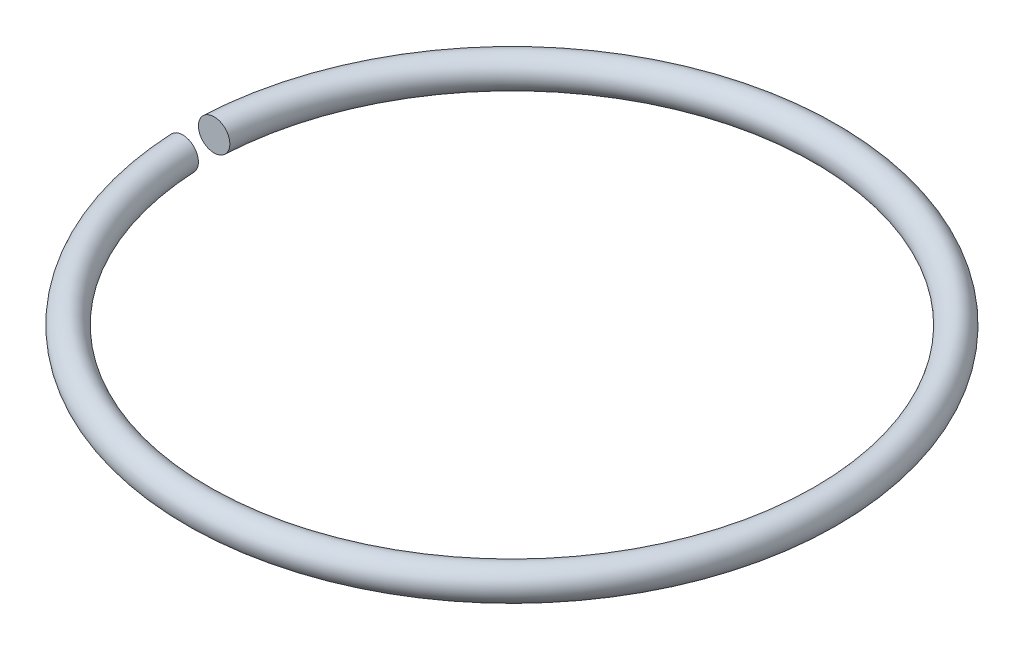
ISO-10303-21;
HEADER;
FILE_DESCRIPTION(('STEP AP214'),'2;1');
FILE_NAME('part.step','',(''),(''),'','','');
FILE_SCHEMA(('AUTOMOTIVE_DESIGN { 1 0 10303 214 1 1 1 1 }'));
ENDSEC;
DATA;
#1=APPLICATION_CONTEXT('core data for automotive mechanical design processes');
#2=APPLICATION_PROTOCOL_DEFINITION('international standard','automotive_design',2000,#1);
#3=PRODUCT_CONTEXT('',#1,'mechanical');
#4=PRODUCT('Part','Part','',(#3));
#5=PRODUCT_RELATED_PRODUCT_CATEGORY('part','',(#4));
#6=PRODUCT_DEFINITION_FORMATION('','',#4);
#7=PRODUCT_DEFINITION_CONTEXT('part definition',#1,'design');
#8=PRODUCT_DEFINITION('design','',#6,#7);
#9=PRODUCT_DEFINITION_SHAPE('','',#8);
#10=(LENGTH_UNIT() NAMED_UNIT(*) SI_UNIT(.MILLI.,.METRE.));
#11=(NAMED_UNIT(*) PLANE_ANGLE_UNIT() SI_UNIT($,.RADIAN.));
#12=(NAMED_UNIT(*) SI_UNIT($,.STERADIAN.) SOLID_ANGLE_UNIT());
#13=UNCERTAINTY_MEASURE_WITH_UNIT(LENGTH_MEASURE(1.E-05),#10,'distance_accuracy_value','');
#14=(GEOMETRIC_REPRESENTATION_CONTEXT(3) GLOBAL_UNCERTAINTY_ASSIGNED_CONTEXT((#13)) GLOBAL_UNIT_ASSIGNED_CONTEXT((#10,
#11,#12)) REPRESENTATION_CONTEXT('',''));
#15=CARTESIAN_POINT('',(0.,0.,0.));
#16=DIRECTION('',(0.,0.,1.));
#17=DIRECTION('',(1.,0.,0.));
#18=AXIS2_PLACEMENT_3D('',#15,#16,#17);
#19=CARTESIAN_POINT('',(0.,1.,0.));
#20=DIRECTION('',(0.,-1.,0.));
#21=DIRECTION('',(0.,0.,-1.));
#22=AXIS2_PLACEMENT_3D('',#19,#20,#21);
#23=TOROIDAL_SURFACE('',#22,20.,1.);
#24=CARTESIAN_POINT('',(-20.7397264348578,0.354571580153049,-0.999999999999999));
#25=CARTESIAN_POINT('',(-20.775985784985,0.397436107572821,-0.999999999999999));
#26=CARTESIAN_POINT('',(-20.8086541414015,0.443391497805317,-0.999999999999999));
#27=CARTESIAN_POINT('',(-20.8658394015595,0.540172500491813,-0.999999999999999));
#28=CARTESIAN_POINT('',(-20.8903465518958,0.591003847433223,-0.999999999999999));
#29=CARTESIAN_POINT('',(-20.930466229488,0.696043069640188,-0.999999999999999));
#30=CARTESIAN_POINT('',(-20.9460826791802,0.750249444168861,-0.999999999999999));
#31=CARTESIAN_POINT('',(-20.9679832298201,0.860500601046777,-0.999999999999999));
#32=CARTESIAN_POINT('',(-20.9742696378459,0.916544925413988,-0.999999999999999));
#33=CARTESIAN_POINT('',(-20.9773384251914,1.02887013053605,-0.999999999999999));
#34=CARTESIAN_POINT('',(-20.9741247478405,1.0851509034606,-0.999999999999999));
#35=CARTESIAN_POINT('',(-20.9582930886649,1.19637584096566,-0.999999999999999));
#36=CARTESIAN_POINT('',(-20.945674757173,1.25131995577046,-0.999999999999999));
#37=CARTESIAN_POINT('',(-20.9113957111979,1.35830466471239,-0.999999999999999));
#38=CARTESIAN_POINT('',(-20.8897359248209,1.41034555624424,-0.999999999999999));
#39=CARTESIAN_POINT('',(-20.8379919527733,1.51005522387422,-0.999999999999999));
#40=CARTESIAN_POINT('',(-20.8079077651246,1.55772399894574,-0.999999999999999));
#41=CARTESIAN_POINT('',(-20.7401511580338,1.64736828382949,-0.999999999999999));
#42=CARTESIAN_POINT('',(-20.702474180337,1.68934034822742,-0.999999999999999));
#43=CARTESIAN_POINT('',(-20.6206152421253,1.76637147375428,-0.999999999999999));
#44=CARTESIAN_POINT('',(-20.5764332589144,1.80143051076274,-0.999999999999999));
#45=CARTESIAN_POINT('',(-20.4827685979295,1.86368057507855,-0.999999999999999));
#46=CARTESIAN_POINT('',(-20.433280344474,1.8908632128544,-0.999999999999999));
#47=CARTESIAN_POINT('',(-20.3304463370768,1.93654492500475,-0.999999999999999));
#48=CARTESIAN_POINT('',(-20.2771005546263,1.95504393519574,-0.999999999999999));
#49=CARTESIAN_POINT('',(-20.1680024027765,1.98285376382727,-0.999999999999999));
#50=CARTESIAN_POINT('',(-20.1122474312558,1.99215437454837,-0.999999999999999));
#51=CARTESIAN_POINT('',(-19.9999673344306,2.00127025699164,-0.999999999999999));
#52=CARTESIAN_POINT('',(-19.9434422057169,2.00108548671129,-0.999999999999999));
#53=CARTESIAN_POINT('',(-19.8311850562664,1.99123290584426,-0.999999999999999));
#54=CARTESIAN_POINT('',(-19.7754536094331,1.98155855479694,-0.999999999999999));
#55=CARTESIAN_POINT('',(-19.6664059174646,1.95299017506983,-0.999999999999999));
#56=CARTESIAN_POINT('',(-19.6130896750881,1.93409613585901,-0.999999999999999));
#57=CARTESIAN_POINT('',(-19.5103911319148,1.88762322598109,-0.999999999999999));
#58=CARTESIAN_POINT('',(-19.4610085672352,1.860044938495,-0.999999999999999));
#59=CARTESIAN_POINT('',(-19.3675795290719,1.79698246329012,-0.999999999999999));
#60=CARTESIAN_POINT('',(-19.3235330358152,1.76149830486806,-0.999999999999999));
#61=CARTESIAN_POINT('',(-19.2420681692452,1.68366235459913,-0.999999999999999));
#62=CARTESIAN_POINT('',(-19.2046441635202,1.64131645794747,-0.999999999999999));
#63=CARTESIAN_POINT('',(-19.1374476505716,1.55093576999427,-0.999999999999999));
#64=CARTESIAN_POINT('',(-19.1076750903877,1.50290101807216,-0.999999999999999));
#65=CARTESIAN_POINT('',(-19.0566675693972,1.4025727404253,-0.999999999999999));
#66=CARTESIAN_POINT('',(-19.0354216060177,1.35028480845699,-0.999999999999999));
#67=CARTESIAN_POINT('',(-19.0020209226786,1.24288173820686,-0.999999999999999));
#68=CARTESIAN_POINT('',(-18.9898661378261,1.18776662010851,-0.999999999999999));
#69=CARTESIAN_POINT('',(-18.9750049211333,1.07634053589628,-0.999999999999999));
#70=CARTESIAN_POINT('',(-18.9722878265192,1.02003099169915,-0.999999999999999));
#71=CARTESIAN_POINT('',(-18.9763500247036,0.907755600627466,-0.999999999999999));
#72=CARTESIAN_POINT('',(-18.9831292877393,0.851789752676267,-0.999999999999999));
#73=CARTESIAN_POINT('',(-19.0059852586884,0.741813701907868,-0.999999999999999));
#74=CARTESIAN_POINT('',(-19.0220582189782,0.687802720126428,-0.999999999999999));
#75=CARTESIAN_POINT('',(-19.0630389949454,0.583243741129407,-0.999999999999999));
#76=CARTESIAN_POINT('',(-19.0879468161359,0.532695746074811,-0.999999999999999));
#77=CARTESIAN_POINT('',(-19.1459019034869,0.436467484380111,-0.999999999999999));
#78=CARTESIAN_POINT('',(-19.1789534628882,0.390789803544154,-0.999999999999999));
#79=CARTESIAN_POINT('',(-19.2522477193309,0.305623173909489,-0.999999999999999));
#80=CARTESIAN_POINT('',(-19.292490471941,0.26613427293794,-0.999999999999999));
#81=CARTESIAN_POINT('',(-19.3790753821808,0.194415617147947,-0.999999999999999));
#82=CARTESIAN_POINT('',(-19.4254247311792,0.162194544465014,-0.999999999999999));
#83=CARTESIAN_POINT('',(-19.5228696374458,0.10597947266564,-0.999999999999999));
#84=CARTESIAN_POINT('',(-19.5739652382999,0.0819855491106003,-0.999999999999999));
#85=CARTESIAN_POINT('',(-19.6795226865169,0.0428748038475855,-0.999999999999999));
#86=CARTESIAN_POINT('',(-19.7339887719687,0.0277694200830511,-0.999999999999999));
#87=CARTESIAN_POINT('',(-19.8446810533615,0.00690999031759179,-0.999999999999999));
#88=CARTESIAN_POINT('',(-19.90090718933,0.00115562604099272,-0.999999999999999));
#89=CARTESIAN_POINT('',(-20.0135648570868,-0.000841386651310134,-0.999999999999999));
#90=CARTESIAN_POINT('',(-20.0699964993226,0.00292220015851783,-0.999999999999999));
#91=CARTESIAN_POINT('',(-20.1814422691657,0.0198723686144294,-0.999999999999999));
#92=CARTESIAN_POINT('',(-20.2364560401173,0.0330612976279066,-0.999999999999999));
#93=CARTESIAN_POINT('',(-20.3435060801263,0.0684958749776883,-0.999999999999999));
#94=CARTESIAN_POINT('',(-20.395541050292,0.0907454403643689,-0.999999999999999));
#95=CARTESIAN_POINT('',(-20.4950851252592,0.143659794592275,-0.999999999999999));
#96=CARTESIAN_POINT('',(-20.5425996093736,0.174314408470719,-0.999999999999999));
#97=CARTESIAN_POINT('',(-20.6150812848411,0.230251575740945,-0.999999999999999));
#98=CARTESIAN_POINT('',(-20.6418367035296,0.253257700006494,-0.999999999999999));
#99=CARTESIAN_POINT('',(-20.6927754989422,0.301960199144801,-0.999999999999999));
#100=CARTESIAN_POINT('',(-20.7169588760885,0.327656573576094,-0.999999999999999));
#101=CARTESIAN_POINT('',(-20.7397264348578,0.354571580153049,-0.999999999999999));
#102=B_SPLINE_CURVE_WITH_KNOTS('',3,(#24,#25,#26,#27,#28,#29,#30,#31,#32,#33,#34,#35,#36,#37,
#38,#39,#40,#41,#42,#43,#44,#45,#46,#47,#48,#49,#50,#51,#52,#53,#54,#55,#56,#57,#58,#59,#60,#61,
#62,#63,#64,#65,#66,#67,#68,#69,#70,#71,#72,#73,#74,#75,#76,#77,#78,#79,#80,#81,#82,#83,#84,#85,
#86,#87,#88,#89,#90,#91,#92,#93,#94,#95,#96,#97,#98,#99,#100,#101),.UNSPECIFIED.,.T.,.F.,(4,2,2,
2,2,2,2,2,2,2,2,2,2,2,2,2,2,2,2,2,2,2,2,2,2,2,2,2,2,2,2,2,2,2,2,2,2,2,4),(0.,0.168302393450667,
0.336805208169993,0.505233624391996,0.67362038567847,0.841937262201897,1.01026039709668,
1.17856625785332,1.34687215812988,1.51527940177551,1.68368723300642,1.85227378961205,
2.02086159227576,2.189636272287,2.35841169965495,2.52730353313736,2.69619555953393,
2.86507624659254,3.0339563078415,3.20269203931158,3.37142660282683,3.5399427286529,
3.70845765159953,3.87678212307554,4.04510606700131,4.21336218266766,4.38161840332887,
4.54996351632377,4.71830993023283,4.88685639777663,5.05540441327658,5.22416884795341,
5.39292753836467,5.56179681150775,5.73070815595409,5.89969260098663,6.06847337363816,
6.17415191584213,6.27983044070445),.UNSPECIFIED.);
#103=CARTESIAN_POINT('',(-20.7397264348578,0.354571580153049,-0.999999999999999));
#104=VERTEX_POINT('',#103);
#105=EDGE_CURVE('E10',#104,#104,#102,.T.);
#106=ORIENTED_EDGE('',*,*,#105,.T.);
#107=EDGE_LOOP('',(#106));
#108=FACE_BOUND('',#107,.T.);
#109=CARTESIAN_POINT('',(-20.7397264348578,0.354571580153049,1.));
#110=CARTESIAN_POINT('',(-20.7034047940602,0.311641145469235,1.));
#111=CARTESIAN_POINT('',(-20.6634278024441,0.27174926949927,1.));
#112=CARTESIAN_POINT('',(-20.5773080112511,0.199213305164222,1.));
#113=CARTESIAN_POINT('',(-20.5311577605172,0.166578104401957,1.));
#114=CARTESIAN_POINT('',(-20.4340539064351,0.109532446690529,1.));
#115=CARTESIAN_POINT('',(-20.3831028381153,0.0851176798206022,1.));
#116=CARTESIAN_POINT('',(-20.2778412901556,0.0451883269571836,1.));
#117=CARTESIAN_POINT('',(-20.223531648473,0.0296715307841985,1.));
#118=CARTESIAN_POINT('',(-20.1130307772283,0.00795353910002325,1.));
#119=CARTESIAN_POINT('',(-20.0568379391804,0.00176052585158059,1.));
#120=CARTESIAN_POINT('',(-19.9442074865518,-0.00110984074930841,1.));
#121=CARTESIAN_POINT('',(-19.8877698613443,0.00221322322871637,1.));
#122=CARTESIAN_POINT('',(-19.7762206448347,0.0182862345459986,1.));
#123=CARTESIAN_POINT('',(-19.7211098182836,0.0310414902355954,1.));
#124=CARTESIAN_POINT('',(-19.6138124748127,0.0656250238229156,1.));
#125=CARTESIAN_POINT('',(-19.5616259528078,0.0874532859428962,1.));
#126=CARTESIAN_POINT('',(-19.4616713700178,0.139561156769367,1.));
#127=CARTESIAN_POINT('',(-19.4139024149254,0.169839049895362,1.));
#128=CARTESIAN_POINT('',(-19.3241321050359,0.237991970901085,1.));
#129=CARTESIAN_POINT('',(-19.2821307145017,0.275866951703998,1.));
#130=CARTESIAN_POINT('',(-19.2051321091724,0.358101200582438,1.));
#131=CARTESIAN_POINT('',(-19.170128208084,0.402454207895982,1.));
#132=CARTESIAN_POINT('',(-19.1080750438647,0.496413831015416,1.));
#133=CARTESIAN_POINT('',(-19.0810257317309,0.546020414454984,1.));
#134=CARTESIAN_POINT('',(-19.0356869450255,0.649009138084592,1.));
#135=CARTESIAN_POINT('',(-19.0173860189593,0.702386237039664,1.));
#136=CARTESIAN_POINT('',(-18.9900157428169,0.811456945960827,1.));
#137=CARTESIAN_POINT('',(-18.9809463275478,0.86715053956492,1.));
#138=CARTESIAN_POINT('',(-18.9723037117957,0.97921111701258,1.));
#139=CARTESIAN_POINT('',(-18.9727206202619,1.03557733822673,1.));
#140=CARTESIAN_POINT('',(-18.9830143062991,1.14743912878021,1.));
#141=CARTESIAN_POINT('',(-18.9928910592975,1.20293470038073,1.));
#142=CARTESIAN_POINT('',(-19.0218178825652,1.31146601084051,1.));
#143=CARTESIAN_POINT('',(-19.0408656481761,1.36450236402781,1.));
#144=CARTESIAN_POINT('',(-19.0875890910121,1.46662750005172,1.));
#145=CARTESIAN_POINT('',(-19.1152647895378,1.51571627314219,1.));
#146=CARTESIAN_POINT('',(-19.1784761366599,1.60858932227425,1.));
#147=CARTESIAN_POINT('',(-19.2140170234836,1.65237003291794,1.));
#148=CARTESIAN_POINT('',(-19.2919361632383,1.73335255756107,1.));
#149=CARTESIAN_POINT('',(-19.3343144600603,1.77055432932548,1.));
#150=CARTESIAN_POINT('',(-19.4247617449274,1.83737267867152,1.));
#151=CARTESIAN_POINT('',(-19.4728377638043,1.86697973906423,1.));
#152=CARTESIAN_POINT('',(-19.5732733838568,1.91771380840324,1.));
#153=CARTESIAN_POINT('',(-19.6256330147084,1.93884075859525,1.));
#154=CARTESIAN_POINT('',(-19.733218136996,1.97204036588693,1.));
#155=CARTESIAN_POINT('',(-19.7884470387187,1.98410197234295,1.));
#156=CARTESIAN_POINT('',(-19.9001457203183,1.9987884752676,1.));
#157=CARTESIAN_POINT('',(-19.9566155063093,2.00141332522953,1.));
#158=CARTESIAN_POINT('',(-20.0692311894231,1.99715038381831,1.));
#159=CARTESIAN_POINT('',(-20.1253768568289,1.99025652014536,1.));
#160=CARTESIAN_POINT('',(-20.235713523669,1.9671390024309,1.));
#161=CARTESIAN_POINT('',(-20.2899045247663,1.95091535632799,1.));
#162=CARTESIAN_POINT('',(-20.3947820748576,1.90959931405184,1.));
#163=CARTESIAN_POINT('',(-20.4454692507455,1.88450850930028,1.));
#164=CARTESIAN_POINT('',(-20.5419069525184,1.8261662981444,1.));
#165=CARTESIAN_POINT('',(-20.5876574885259,1.79291490847357,1.));
#166=CARTESIAN_POINT('',(-20.6728799884495,1.71922510647458,1.));
#167=CARTESIAN_POINT('',(-20.712357334282,1.67879291848648,1.));
#168=CARTESIAN_POINT('',(-20.7839543310763,1.59186800172918,1.));
#169=CARTESIAN_POINT('',(-20.8160740120422,1.54537529767553,1.));
#170=CARTESIAN_POINT('',(-20.8720054786543,1.44770543881132,1.));
#171=CARTESIAN_POINT('',(-20.8958265820224,1.39653361982322,1.));
#172=CARTESIAN_POINT('',(-20.9345292272749,1.29091643062336,1.));
#173=CARTESIAN_POINT('',(-20.9494111725162,1.23647120823762,1.));
#174=CARTESIAN_POINT('',(-20.9698005345742,1.12591319969718,1.));
#175=CARTESIAN_POINT('',(-20.9753179040413,1.06980224851311,1.));
#176=CARTESIAN_POINT('',(-20.9768503298216,0.957435494935053,1.));
#177=CARTESIAN_POINT('',(-20.9728630498039,0.901179660322667,1.));
#178=CARTESIAN_POINT('',(-20.9554988185881,0.790137671618542,1.));
#179=CARTESIAN_POINT('',(-20.9421211757822,0.735351626086534,1.));
#180=CARTESIAN_POINT('',(-20.9063640391434,0.628851094382731,1.));
#181=CARTESIAN_POINT('',(-20.8839954085583,0.577132987641342,1.));
#182=CARTESIAN_POINT('',(-20.8409441157667,0.496873746089144,1.));
#183=CARTESIAN_POINT('',(-20.8228013619059,0.466941668519371,1.));
#184=CARTESIAN_POINT('',(-20.7834857118463,0.409138594700949,1.));
#185=CARTESIAN_POINT('',(-20.7623128162708,0.381267598028344,1.));
#186=CARTESIAN_POINT('',(-20.7397264348578,0.354571580153049,1.));
#187=B_SPLINE_CURVE_WITH_KNOTS('',3,(#109,#110,#111,#112,#113,#114,#115,#116,#117,#118,#119,
#120,#121,#122,#123,#124,#125,#126,#127,#128,#129,#130,#131,#132,#133,#134,#135,#136,#137,#138,
#139,#140,#141,#142,#143,#144,#145,#146,#147,#148,#149,#150,#151,#152,#153,#154,#155,#156,#157,
#158,#159,#160,#161,#162,#163,#164,#165,#166,#167,#168,#169,#170,#171,#172,#173,#174,#175,#176,
#177,#178,#179,#180,#181,#182,#183,#184,#185,#186),.UNSPECIFIED.,.T.,.F.,(4,2,2,2,2,2,2,2,2,2,2,
2,2,2,2,2,2,2,2,2,2,2,2,2,2,2,2,2,2,2,2,2,2,2,2,2,2,2,4),(0.,0.168574739246387,
0.337354816685031,0.50604626551468,0.674695794667106,0.843493239322492,1.0122980867547,
1.18119800836752,1.35009763626862,1.51896299635898,1.68782731007497,1.85652948982574,
2.02523063029364,2.19371033489434,2.36218884968156,2.5304917059963,2.6987941251341,
2.86705427224686,3.035314834763,3.20368779813239,3.37206184237185,3.54064586226109,
3.70923105016162,3.87802141138415,4.0468126044468,4.21571152471405,4.38461030126745,
4.55347878031539,4.72234691309688,4.89106937853333,5.05979115592012,5.22832287564679,
5.39684699023511,5.56519188535576,5.73357816547605,5.90197684868257,6.07017267499182,
6.17499982643067,6.27982695630694),.UNSPECIFIED.);
#188=CARTESIAN_POINT('',(-20.7397264348578,0.354571580153049,1.));
#189=VERTEX_POINT('',#188);
#190=EDGE_CURVE('E43',#189,#189,#187,.T.);
#191=ORIENTED_EDGE('',*,*,#190,.T.);
#192=EDGE_LOOP('',(#191));
#193=FACE_BOUND('',#192,.T.);
#194=ADVANCED_FACE('F32',(#108,#193),#23,.T.);
#195=CARTESIAN_POINT('',(-23.1189285045633,-1.2E-05,1.));
#196=DIRECTION('',(0.,0.,1.));
#197=DIRECTION('',(1.,0.,0.));
#198=AXIS2_PLACEMENT_3D('',#195,#196,#197);
#199=PLANE('',#198);
#200=ORIENTED_EDGE('',*,*,#190,.F.);
#201=EDGE_LOOP('',(#200));
#202=FACE_BOUND('',#201,.T.);
#203=ADVANCED_FACE('F52',(#202),#199,.F.);
#204=CARTESIAN_POINT('',(-23.1189285045633,-1.2E-05,-0.999999999999999));
#205=DIRECTION('',(0.,0.,-1.));
#206=DIRECTION('',(-1.,0.,0.));
#207=AXIS2_PLACEMENT_3D('',#204,#205,#206);
#208=PLANE('',#207);
#209=ORIENTED_EDGE('',*,*,#105,.F.);
#210=EDGE_LOOP('',(#209));
#211=FACE_BOUND('',#210,.T.);
#212=ADVANCED_FACE('F55',(#211),#208,.F.);
#213=CLOSED_SHELL('',(#194,#203,#212));
#214=MANIFOLD_SOLID_BREP('B2',#213);
#215=ADVANCED_BREP_SHAPE_REPRESENTATION('',(#18,#214),#14);
#216=SHAPE_DEFINITION_REPRESENTATION(#9,#215);
ENDSEC;
END-ISO-10303-21;
